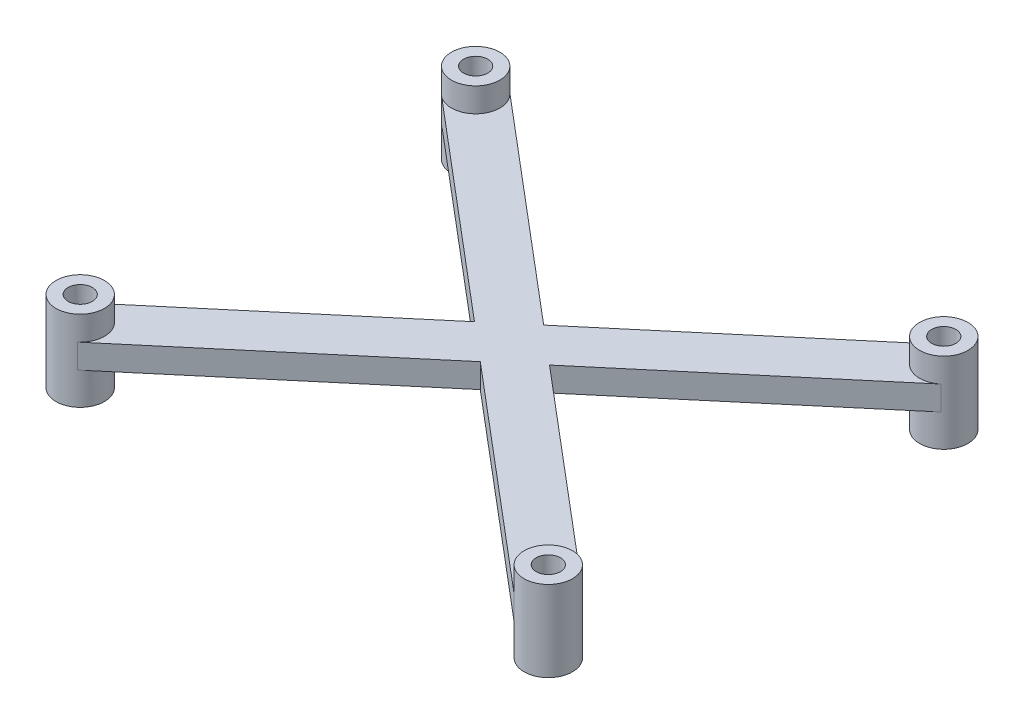
ISO-10303-21;
HEADER;
FILE_DESCRIPTION(('STEP AP214'),'2;1');
FILE_NAME('part.step','',(''),(''),'','','');
FILE_SCHEMA(('AUTOMOTIVE_DESIGN { 1 0 10303 214 1 1 1 1 }'));
ENDSEC;
DATA;
#1=APPLICATION_CONTEXT('core data for automotive mechanical design processes');
#2=APPLICATION_PROTOCOL_DEFINITION('international standard','automotive_design',2000,#1);
#3=PRODUCT_CONTEXT('',#1,'mechanical');
#4=PRODUCT('Part','Part','',(#3));
#5=PRODUCT_RELATED_PRODUCT_CATEGORY('part','',(#4));
#6=PRODUCT_DEFINITION_FORMATION('','',#4);
#7=PRODUCT_DEFINITION_CONTEXT('part definition',#1,'design');
#8=PRODUCT_DEFINITION('design','',#6,#7);
#9=PRODUCT_DEFINITION_SHAPE('','',#8);
#10=(LENGTH_UNIT() NAMED_UNIT(*) SI_UNIT(.MILLI.,.METRE.));
#11=(NAMED_UNIT(*) PLANE_ANGLE_UNIT() SI_UNIT($,.RADIAN.));
#12=(NAMED_UNIT(*) SI_UNIT($,.STERADIAN.) SOLID_ANGLE_UNIT());
#13=UNCERTAINTY_MEASURE_WITH_UNIT(LENGTH_MEASURE(1.E-05),#10,'distance_accuracy_value','');
#14=(GEOMETRIC_REPRESENTATION_CONTEXT(3) GLOBAL_UNCERTAINTY_ASSIGNED_CONTEXT((#13)) GLOBAL_UNIT_ASSIGNED_CONTEXT((#10,
#11,#12)) REPRESENTATION_CONTEXT('',''));
#15=CARTESIAN_POINT('',(0.,0.,0.));
#16=DIRECTION('',(0.,0.,1.));
#17=DIRECTION('',(1.,0.,0.));
#18=AXIS2_PLACEMENT_3D('',#15,#16,#17);
#19=CARTESIAN_POINT('',(-29.,-4.,-24.5));
#20=DIRECTION('',(0.,1.,0.));
#21=DIRECTION('',(0.,0.,1.));
#22=AXIS2_PLACEMENT_3D('',#19,#20,#21);
#23=CYLINDRICAL_SURFACE('',#22,3.);
#24=CARTESIAN_POINT('',(-29.,-4.,-24.5));
#25=DIRECTION('',(0.,1.,0.));
#26=DIRECTION('',(0.,0.,1.));
#27=AXIS2_PLACEMENT_3D('',#24,#25,#26);
#28=CIRCLE('',#27,3.);
#29=CARTESIAN_POINT('',(-29.,-4.,-21.5));
#30=VERTEX_POINT('',#29);
#31=EDGE_CURVE('E296',#30,#30,#28,.T.);
#32=ORIENTED_EDGE('',*,*,#31,.T.);
#33=EDGE_LOOP('',(#32));
#34=FACE_BOUND('',#33,.T.);
#35=CARTESIAN_POINT('',(-29.,0.,-24.5));
#36=DIRECTION('',(0.,1.,0.));
#37=DIRECTION('',(0.,0.,1.));
#38=AXIS2_PLACEMENT_3D('',#35,#36,#37);
#39=CIRCLE('',#38,3.);
#40=CARTESIAN_POINT('',(-30.9360549475046,0.,-22.2083431233619));
#41=VERTEX_POINT('',#40);
#42=CARTESIAN_POINT('',(-27.0639450524954,0.,-26.7916568766381));
#43=VERTEX_POINT('',#42);
#44=EDGE_CURVE('E206',#41,#43,#39,.T.);
#45=ORIENTED_EDGE('',*,*,#44,.F.);
#46=DIRECTION('',(0.,-1.,0.));
#47=VECTOR('',#46,1.);
#48=CARTESIAN_POINT('',(-30.9360549475046,3.,-22.2083431233619));
#49=LINE('',#48,#47);
#50=CARTESIAN_POINT('',(-30.9360549475046,3.,-22.2083431233619));
#51=VERTEX_POINT('',#50);
#52=EDGE_CURVE('E298',#51,#41,#49,.T.);
#53=ORIENTED_EDGE('',*,*,#52,.F.);
#54=CARTESIAN_POINT('',(-29.,3.,-24.5));
#55=DIRECTION('',(0.,1.,0.));
#56=DIRECTION('',(0.,0.,1.));
#57=AXIS2_PLACEMENT_3D('',#54,#55,#56);
#58=CIRCLE('',#57,3.);
#59=CARTESIAN_POINT('',(-27.0639450524954,3.,-26.7916568766381));
#60=VERTEX_POINT('',#59);
#61=EDGE_CURVE('E212',#51,#60,#58,.T.);
#62=ORIENTED_EDGE('',*,*,#61,.T.);
#63=DIRECTION('',(0.,-1.,0.));
#64=VECTOR('',#63,1.);
#65=CARTESIAN_POINT('',(-27.0639450524954,3.,-26.7916568766381));
#66=LINE('',#65,#64);
#67=EDGE_CURVE('E301',#60,#43,#66,.T.);
#68=ORIENTED_EDGE('',*,*,#67,.T.);
#69=EDGE_LOOP('',(#45,#53,#62,#68));
#70=FACE_BOUND('',#69,.T.);
#71=CARTESIAN_POINT('',(-29.,6.,-24.5));
#72=DIRECTION('',(0.,1.,0.));
#73=DIRECTION('',(0.,0.,1.));
#74=AXIS2_PLACEMENT_3D('',#71,#72,#73);
#75=CIRCLE('',#74,3.);
#76=CARTESIAN_POINT('',(-29.,6.,-21.5));
#77=VERTEX_POINT('',#76);
#78=EDGE_CURVE('E478',#77,#77,#75,.T.);
#79=ORIENTED_EDGE('',*,*,#78,.F.);
#80=EDGE_LOOP('',(#79));
#81=FACE_BOUND('',#80,.T.);
#82=ADVANCED_FACE('F203',(#34,#70,#81),#23,.T.);
#83=CARTESIAN_POINT('',(-29.,-4.,-24.5));
#84=DIRECTION('',(0.,1.,0.));
#85=DIRECTION('',(0.,0.,1.));
#86=AXIS2_PLACEMENT_3D('',#83,#84,#85);
#87=PLANE('',#86);
#88=CARTESIAN_POINT('',(-29.,-4.,-24.5));
#89=DIRECTION('',(0.,1.,0.));
#90=DIRECTION('',(0.,0.,1.));
#91=AXIS2_PLACEMENT_3D('',#88,#89,#90);
#92=CIRCLE('',#91,1.5);
#93=CARTESIAN_POINT('',(-29.,-4.,-23.));
#94=VERTEX_POINT('',#93);
#95=EDGE_CURVE('E477',#94,#94,#92,.T.);
#96=ORIENTED_EDGE('',*,*,#95,.T.);
#97=EDGE_LOOP('',(#96));
#98=FACE_BOUND('',#97,.T.);
#99=ORIENTED_EDGE('',*,*,#31,.F.);
#100=EDGE_LOOP('',(#99));
#101=FACE_BOUND('',#100,.T.);
#102=ADVANCED_FACE('F514',(#98,#101),#87,.F.);
#103=CARTESIAN_POINT('',(0.,0.,0.));
#104=DIRECTION('',(0.,1.,0.));
#105=DIRECTION('',(0.,0.,1.));
#106=AXIS2_PLACEMENT_3D('',#103,#104,#105);
#107=PLANE('',#106);
#108=DIRECTION('',(-0.763885625546045,0.,0.64535164916821));
#109=VECTOR('',#108,1.);
#110=CARTESIAN_POINT('',(-1.93605494750463,0.,-2.29165687663813));
#111=LINE('',#110,#109);
#112=CARTESIAN_POINT('',(27.0639450524954,0.,-26.7916568766381));
#113=VERTEX_POINT('',#112);
#114=CARTESIAN_POINT('',(0.,0.,-3.92728950470238));
#115=VERTEX_POINT('',#114);
#116=EDGE_CURVE('E332',#113,#115,#111,.T.);
#117=ORIENTED_EDGE('',*,*,#116,.F.);
#118=CARTESIAN_POINT('',(29.,0.,-24.5));
#119=DIRECTION('',(0.,1.,0.));
#120=DIRECTION('',(0.,0.,1.));
#121=AXIS2_PLACEMENT_3D('',#118,#119,#120);
#122=CIRCLE('',#121,3.);
#123=CARTESIAN_POINT('',(30.9360549475046,0.,-22.2083431233619));
#124=VERTEX_POINT('',#123);
#125=EDGE_CURVE('E398',#113,#124,#122,.T.);
#126=ORIENTED_EDGE('',*,*,#125,.T.);
#127=DIRECTION('',(-0.763885625546044,0.,0.64535164916821));
#128=VECTOR('',#127,1.);
#129=CARTESIAN_POINT('',(1.93605494750463,0.,2.29165687663813));
#130=LINE('',#129,#128);
#131=CARTESIAN_POINT('',(4.64862839332119,0.,0.));
#132=VERTEX_POINT('',#131);
#133=EDGE_CURVE('E328',#124,#132,#130,.T.);
#134=ORIENTED_EDGE('',*,*,#133,.T.);
#135=DIRECTION('',(0.763885625546045,0.,0.64535164916821));
#136=VECTOR('',#135,1.);
#137=CARTESIAN_POINT('',(1.93605494750463,0.,-2.29165687663813));
#138=LINE('',#137,#136);
#139=CARTESIAN_POINT('',(30.9360549475046,0.,22.2083431233619));
#140=VERTEX_POINT('',#139);
#141=EDGE_CURVE('E324',#132,#140,#138,.T.);
#142=ORIENTED_EDGE('',*,*,#141,.T.);
#143=CARTESIAN_POINT('',(29.,0.,24.5));
#144=DIRECTION('',(0.,1.,0.));
#145=DIRECTION('',(0.,0.,1.));
#146=AXIS2_PLACEMENT_3D('',#143,#144,#145);
#147=CIRCLE('',#146,3.);
#148=CARTESIAN_POINT('',(27.0639450524954,0.,26.7916568766381));
#149=VERTEX_POINT('',#148);
#150=EDGE_CURVE('E424',#140,#149,#147,.T.);
#151=ORIENTED_EDGE('',*,*,#150,.T.);
#152=DIRECTION('',(0.763885625546045,0.,0.64535164916821));
#153=VECTOR('',#152,1.);
#154=CARTESIAN_POINT('',(-1.93605494750463,0.,2.29165687663813));
#155=LINE('',#154,#153);
#156=CARTESIAN_POINT('',(0.,0.,3.92728950470239));
#157=VERTEX_POINT('',#156);
#158=EDGE_CURVE('E319',#157,#149,#155,.T.);
#159=ORIENTED_EDGE('',*,*,#158,.F.);
#160=DIRECTION('',(-0.763885625546044,0.,0.64535164916821));
#161=VECTOR('',#160,1.);
#162=CARTESIAN_POINT('',(1.93605494750463,0.,2.29165687663813));
#163=LINE('',#162,#161);
#164=CARTESIAN_POINT('',(-27.0639450524954,0.,26.7916568766381));
#165=VERTEX_POINT('',#164);
#166=EDGE_CURVE('E315',#157,#165,#163,.T.);
#167=ORIENTED_EDGE('',*,*,#166,.T.);
#168=CARTESIAN_POINT('',(-29.,0.,24.5));
#169=DIRECTION('',(0.,1.,0.));
#170=DIRECTION('',(0.,0.,1.));
#171=AXIS2_PLACEMENT_3D('',#168,#169,#170);
#172=CIRCLE('',#171,3.);
#173=CARTESIAN_POINT('',(-30.9360549475046,0.,22.2083431233619));
#174=VERTEX_POINT('',#173);
#175=EDGE_CURVE('E320',#165,#174,#172,.T.);
#176=ORIENTED_EDGE('',*,*,#175,.T.);
#177=DIRECTION('',(-0.763885625546045,0.,0.64535164916821));
#178=VECTOR('',#177,1.);
#179=CARTESIAN_POINT('',(-1.93605494750463,0.,-2.29165687663813));
#180=LINE('',#179,#178);
#181=CARTESIAN_POINT('',(-4.64862839332119,0.,0.));
#182=VERTEX_POINT('',#181);
#183=EDGE_CURVE('E342',#182,#174,#180,.T.);
#184=ORIENTED_EDGE('',*,*,#183,.F.);
#185=DIRECTION('',(0.763885625546045,0.,0.64535164916821));
#186=VECTOR('',#185,1.);
#187=CARTESIAN_POINT('',(-1.93605494750463,0.,2.29165687663813));
#188=LINE('',#187,#186);
#189=EDGE_CURVE('E261',#41,#182,#188,.T.);
#190=ORIENTED_EDGE('',*,*,#189,.F.);
#191=ORIENTED_EDGE('',*,*,#44,.T.);
#192=DIRECTION('',(0.763885625546045,0.,0.64535164916821));
#193=VECTOR('',#192,1.);
#194=CARTESIAN_POINT('',(1.93605494750463,0.,-2.29165687663813));
#195=LINE('',#194,#193);
#196=EDGE_CURVE('E336',#43,#115,#195,.T.);
#197=ORIENTED_EDGE('',*,*,#196,.T.);
#198=EDGE_LOOP('',(#117,#126,#134,#142,#151,#159,#167,#176,#184,#190,#191,#197));
#199=FACE_BOUND('',#198,.T.);
#200=ADVANCED_FACE('F386',(#199),#107,.F.);
#201=CARTESIAN_POINT('',(1.93605494750463,3.,2.29165687663813));
#202=DIRECTION('',(0.64535164916821,0.,0.763885625546044));
#203=DIRECTION('',(0.763885625546044,0.,-0.64535164916821));
#204=AXIS2_PLACEMENT_3D('',#201,#202,#203);
#205=PLANE('',#204);
#206=ORIENTED_EDGE('',*,*,#166,.F.);
#207=DIRECTION('',(0.,-1.,0.));
#208=VECTOR('',#207,1.);
#209=CARTESIAN_POINT('',(0.,3.,3.92728950470239));
#210=LINE('',#209,#208);
#211=CARTESIAN_POINT('',(0.,3.,3.92728950470239));
#212=VERTEX_POINT('',#211);
#213=EDGE_CURVE('E269',#212,#157,#210,.T.);
#214=ORIENTED_EDGE('',*,*,#213,.F.);
#215=DIRECTION('',(-0.763885625546044,0.,0.64535164916821));
#216=VECTOR('',#215,1.);
#217=CARTESIAN_POINT('',(1.93605494750463,3.,2.29165687663813));
#218=LINE('',#217,#216);
#219=CARTESIAN_POINT('',(-27.0639450524954,3.,26.7916568766381));
#220=VERTEX_POINT('',#219);
#221=EDGE_CURVE('E345',#212,#220,#218,.T.);
#222=ORIENTED_EDGE('',*,*,#221,.T.);
#223=DIRECTION('',(0.,-1.,0.));
#224=VECTOR('',#223,1.);
#225=CARTESIAN_POINT('',(-27.0639450524954,3.,26.7916568766381));
#226=LINE('',#225,#224);
#227=EDGE_CURVE('E376',#220,#165,#226,.T.);
#228=ORIENTED_EDGE('',*,*,#227,.T.);
#229=EDGE_LOOP('',(#206,#214,#222,#228));
#230=FACE_BOUND('',#229,.T.);
#231=ADVANCED_FACE('F523',(#230),#205,.T.);
#232=CARTESIAN_POINT('',(-1.93605494750463,3.,2.29165687663813));
#233=DIRECTION('',(0.64535164916821,0.,-0.763885625546044));
#234=DIRECTION('',(-0.763885625546044,0.,-0.64535164916821));
#235=AXIS2_PLACEMENT_3D('',#232,#233,#234);
#236=PLANE('',#235);
#237=ORIENTED_EDGE('',*,*,#158,.T.);
#238=DIRECTION('',(0.,-1.,0.));
#239=VECTOR('',#238,1.);
#240=CARTESIAN_POINT('',(27.0639450524954,3.,26.7916568766381));
#241=LINE('',#240,#239);
#242=CARTESIAN_POINT('',(27.0639450524954,3.,26.7916568766381));
#243=VERTEX_POINT('',#242);
#244=EDGE_CURVE('E370',#243,#149,#241,.T.);
#245=ORIENTED_EDGE('',*,*,#244,.F.);
#246=DIRECTION('',(0.763885625546045,0.,0.64535164916821));
#247=VECTOR('',#246,1.);
#248=CARTESIAN_POINT('',(-1.93605494750463,3.,2.29165687663813));
#249=LINE('',#248,#247);
#250=EDGE_CURVE('E437',#212,#243,#249,.T.);
#251=ORIENTED_EDGE('',*,*,#250,.F.);
#252=ORIENTED_EDGE('',*,*,#213,.T.);
#253=EDGE_LOOP('',(#237,#245,#251,#252));
#254=FACE_BOUND('',#253,.T.);
#255=ADVANCED_FACE('F436',(#254),#236,.F.);
#256=CARTESIAN_POINT('',(1.93605494750463,3.,-2.29165687663813));
#257=DIRECTION('',(0.64535164916821,0.,-0.763885625546044));
#258=DIRECTION('',(-0.763885625546044,0.,-0.64535164916821));
#259=AXIS2_PLACEMENT_3D('',#256,#257,#258);
#260=PLANE('',#259);
#261=ORIENTED_EDGE('',*,*,#141,.F.);
#262=DIRECTION('',(0.,-1.,0.));
#263=VECTOR('',#262,1.);
#264=CARTESIAN_POINT('',(4.64862839332119,3.,0.));
#265=LINE('',#264,#263);
#266=CARTESIAN_POINT('',(4.64862839332119,3.,0.));
#267=VERTEX_POINT('',#266);
#268=EDGE_CURVE('E363',#267,#132,#265,.T.);
#269=ORIENTED_EDGE('',*,*,#268,.F.);
#270=DIRECTION('',(0.763885625546045,0.,0.64535164916821));
#271=VECTOR('',#270,1.);
#272=CARTESIAN_POINT('',(1.93605494750463,3.,-2.29165687663813));
#273=LINE('',#272,#271);
#274=CARTESIAN_POINT('',(30.9360549475046,3.,22.2083431233619));
#275=VERTEX_POINT('',#274);
#276=EDGE_CURVE('E440',#267,#275,#273,.T.);
#277=ORIENTED_EDGE('',*,*,#276,.T.);
#278=DIRECTION('',(0.,-1.,0.));
#279=VECTOR('',#278,1.);
#280=CARTESIAN_POINT('',(30.9360549475046,3.,22.2083431233619));
#281=LINE('',#280,#279);
#282=EDGE_CURVE('E366',#275,#140,#281,.T.);
#283=ORIENTED_EDGE('',*,*,#282,.T.);
#284=EDGE_LOOP('',(#261,#269,#277,#283));
#285=FACE_BOUND('',#284,.T.);
#286=ADVANCED_FACE('F420',(#285),#260,.T.);
#287=CARTESIAN_POINT('',(1.93605494750463,3.,2.29165687663813));
#288=DIRECTION('',(0.64535164916821,0.,0.763885625546044));
#289=DIRECTION('',(0.763885625546044,0.,-0.64535164916821));
#290=AXIS2_PLACEMENT_3D('',#287,#288,#289);
#291=PLANE('',#290);
#292=ORIENTED_EDGE('',*,*,#133,.F.);
#293=DIRECTION('',(0.,-1.,0.));
#294=VECTOR('',#293,1.);
#295=CARTESIAN_POINT('',(30.9360549475046,3.,-22.2083431233619));
#296=LINE('',#295,#294);
#297=CARTESIAN_POINT('',(30.9360549475046,3.,-22.2083431233619));
#298=VERTEX_POINT('',#297);
#299=EDGE_CURVE('E359',#298,#124,#296,.T.);
#300=ORIENTED_EDGE('',*,*,#299,.F.);
#301=DIRECTION('',(-0.763885625546044,0.,0.64535164916821));
#302=VECTOR('',#301,1.);
#303=CARTESIAN_POINT('',(1.93605494750463,3.,2.29165687663813));
#304=LINE('',#303,#302);
#305=EDGE_CURVE('E416',#298,#267,#304,.T.);
#306=ORIENTED_EDGE('',*,*,#305,.T.);
#307=ORIENTED_EDGE('',*,*,#268,.T.);
#308=EDGE_LOOP('',(#292,#300,#306,#307));
#309=FACE_BOUND('',#308,.T.);
#310=ADVANCED_FACE('F413',(#309),#291,.T.);
#311=CARTESIAN_POINT('',(-1.93605494750463,3.,-2.29165687663813));
#312=DIRECTION('',(0.64535164916821,0.,0.763885625546044));
#313=DIRECTION('',(0.763885625546045,0.,-0.64535164916821));
#314=AXIS2_PLACEMENT_3D('',#311,#312,#313);
#315=PLANE('',#314);
#316=ORIENTED_EDGE('',*,*,#116,.T.);
#317=DIRECTION('',(0.,-1.,0.));
#318=VECTOR('',#317,1.);
#319=CARTESIAN_POINT('',(0.,3.,-3.92728950470238));
#320=LINE('',#319,#318);
#321=CARTESIAN_POINT('',(0.,3.,-3.92728950470238));
#322=VERTEX_POINT('',#321);
#323=EDGE_CURVE('E352',#322,#115,#320,.T.);
#324=ORIENTED_EDGE('',*,*,#323,.F.);
#325=DIRECTION('',(-0.763885625546045,0.,0.64535164916821));
#326=VECTOR('',#325,1.);
#327=CARTESIAN_POINT('',(-1.93605494750463,3.,-2.29165687663813));
#328=LINE('',#327,#326);
#329=CARTESIAN_POINT('',(27.0639450524954,3.,-26.7916568766381));
#330=VERTEX_POINT('',#329);
#331=EDGE_CURVE('E311',#330,#322,#328,.T.);
#332=ORIENTED_EDGE('',*,*,#331,.F.);
#333=DIRECTION('',(0.,-1.,0.));
#334=VECTOR('',#333,1.);
#335=CARTESIAN_POINT('',(27.0639450524954,3.,-26.7916568766381));
#336=LINE('',#335,#334);
#337=EDGE_CURVE('E355',#330,#113,#336,.T.);
#338=ORIENTED_EDGE('',*,*,#337,.T.);
#339=EDGE_LOOP('',(#316,#324,#332,#338));
#340=FACE_BOUND('',#339,.T.);
#341=ADVANCED_FACE('F394',(#340),#315,.F.);
#342=CARTESIAN_POINT('',(1.93605494750463,3.,-2.29165687663813));
#343=DIRECTION('',(0.64535164916821,0.,-0.763885625546044));
#344=DIRECTION('',(-0.763885625546044,0.,-0.64535164916821));
#345=AXIS2_PLACEMENT_3D('',#342,#343,#344);
#346=PLANE('',#345);
#347=ORIENTED_EDGE('',*,*,#196,.F.);
#348=ORIENTED_EDGE('',*,*,#67,.F.);
#349=DIRECTION('',(0.763885625546045,0.,0.64535164916821));
#350=VECTOR('',#349,1.);
#351=CARTESIAN_POINT('',(1.93605494750463,3.,-2.29165687663813));
#352=LINE('',#351,#350);
#353=EDGE_CURVE('E293',#60,#322,#352,.T.);
#354=ORIENTED_EDGE('',*,*,#353,.T.);
#355=ORIENTED_EDGE('',*,*,#323,.T.);
#356=EDGE_LOOP('',(#347,#348,#354,#355));
#357=FACE_BOUND('',#356,.T.);
#358=ADVANCED_FACE('F390',(#357),#346,.T.);
#359=CARTESIAN_POINT('',(-1.93605494750463,3.,2.29165687663813));
#360=DIRECTION('',(0.64535164916821,0.,-0.763885625546044));
#361=DIRECTION('',(-0.763885625546044,0.,-0.64535164916821));
#362=AXIS2_PLACEMENT_3D('',#359,#360,#361);
#363=PLANE('',#362);
#364=ORIENTED_EDGE('',*,*,#189,.T.);
#365=DIRECTION('',(0.,-1.,0.));
#366=VECTOR('',#365,1.);
#367=CARTESIAN_POINT('',(-4.64862839332119,3.,0.));
#368=LINE('',#367,#366);
#369=CARTESIAN_POINT('',(-4.64862839332119,3.,0.));
#370=VERTEX_POINT('',#369);
#371=EDGE_CURVE('E302',#370,#182,#368,.T.);
#372=ORIENTED_EDGE('',*,*,#371,.F.);
#373=DIRECTION('',(0.763885625546045,0.,0.64535164916821));
#374=VECTOR('',#373,1.);
#375=CARTESIAN_POINT('',(-1.93605494750463,3.,2.29165687663813));
#376=LINE('',#375,#374);
#377=EDGE_CURVE('E290',#51,#370,#376,.T.);
#378=ORIENTED_EDGE('',*,*,#377,.F.);
#379=ORIENTED_EDGE('',*,*,#52,.T.);
#380=EDGE_LOOP('',(#364,#372,#378,#379));
#381=FACE_BOUND('',#380,.T.);
#382=ADVANCED_FACE('F304',(#381),#363,.F.);
#383=CARTESIAN_POINT('',(-1.93605494750463,3.,-2.29165687663813));
#384=DIRECTION('',(0.64535164916821,0.,0.763885625546044));
#385=DIRECTION('',(0.763885625546045,0.,-0.64535164916821));
#386=AXIS2_PLACEMENT_3D('',#383,#384,#385);
#387=PLANE('',#386);
#388=ORIENTED_EDGE('',*,*,#183,.T.);
#389=DIRECTION('',(0.,-1.,0.));
#390=VECTOR('',#389,1.);
#391=CARTESIAN_POINT('',(-30.9360549475046,3.,22.2083431233619));
#392=LINE('',#391,#390);
#393=CARTESIAN_POINT('',(-30.9360549475046,3.,22.2083431233619));
#394=VERTEX_POINT('',#393);
#395=EDGE_CURVE('E228',#394,#174,#392,.T.);
#396=ORIENTED_EDGE('',*,*,#395,.F.);
#397=DIRECTION('',(-0.763885625546045,0.,0.64535164916821));
#398=VECTOR('',#397,1.);
#399=CARTESIAN_POINT('',(-1.93605494750463,3.,-2.29165687663813));
#400=LINE('',#399,#398);
#401=EDGE_CURVE('E306',#370,#394,#400,.T.);
#402=ORIENTED_EDGE('',*,*,#401,.F.);
#403=ORIENTED_EDGE('',*,*,#371,.T.);
#404=EDGE_LOOP('',(#388,#396,#402,#403));
#405=FACE_BOUND('',#404,.T.);
#406=ADVANCED_FACE('F544',(#405),#387,.F.);
#407=CARTESIAN_POINT('',(0.,3.,0.));
#408=DIRECTION('',(0.,1.,0.));
#409=DIRECTION('',(0.,0.,1.));
#410=AXIS2_PLACEMENT_3D('',#407,#408,#409);
#411=PLANE('',#410);
#412=CARTESIAN_POINT('',(29.,3.,-24.5));
#413=DIRECTION('',(0.,1.,0.));
#414=DIRECTION('',(0.,0.,1.));
#415=AXIS2_PLACEMENT_3D('',#412,#413,#414);
#416=CIRCLE('',#415,3.);
#417=EDGE_CURVE('E12',#330,#298,#416,.T.);
#418=ORIENTED_EDGE('',*,*,#417,.F.);
#419=ORIENTED_EDGE('',*,*,#331,.T.);
#420=ORIENTED_EDGE('',*,*,#353,.F.);
#421=ORIENTED_EDGE('',*,*,#61,.F.);
#422=ORIENTED_EDGE('',*,*,#377,.T.);
#423=ORIENTED_EDGE('',*,*,#401,.T.);
#424=CARTESIAN_POINT('',(-29.,3.,24.5));
#425=DIRECTION('',(0.,1.,0.));
#426=DIRECTION('',(0.,0.,1.));
#427=AXIS2_PLACEMENT_3D('',#424,#425,#426);
#428=CIRCLE('',#427,3.);
#429=EDGE_CURVE('E445',#220,#394,#428,.T.);
#430=ORIENTED_EDGE('',*,*,#429,.F.);
#431=ORIENTED_EDGE('',*,*,#221,.F.);
#432=ORIENTED_EDGE('',*,*,#250,.T.);
#433=CARTESIAN_POINT('',(29.,3.,24.5));
#434=DIRECTION('',(0.,1.,0.));
#435=DIRECTION('',(0.,0.,1.));
#436=AXIS2_PLACEMENT_3D('',#433,#434,#435);
#437=CIRCLE('',#436,3.);
#438=EDGE_CURVE('E433',#275,#243,#437,.T.);
#439=ORIENTED_EDGE('',*,*,#438,.F.);
#440=ORIENTED_EDGE('',*,*,#276,.F.);
#441=ORIENTED_EDGE('',*,*,#305,.F.);
#442=EDGE_LOOP('',(#418,#419,#420,#421,#422,#423,#430,#431,#432,#439,#440,#441));
#443=FACE_BOUND('',#442,.T.);
#444=ADVANCED_FACE('F288',(#443),#411,.T.);
#445=CARTESIAN_POINT('',(29.,3.,-24.5));
#446=DIRECTION('',(0.,-1.,0.));
#447=DIRECTION('',(0.,0.,-1.));
#448=AXIS2_PLACEMENT_3D('',#445,#446,#447);
#449=CYLINDRICAL_SURFACE('',#448,2.99999999999999);
#450=ORIENTED_EDGE('',*,*,#337,.F.);
#451=ORIENTED_EDGE('',*,*,#417,.T.);
#452=ORIENTED_EDGE('',*,*,#299,.T.);
#453=ORIENTED_EDGE('',*,*,#125,.F.);
#454=EDGE_LOOP('',(#450,#451,#452,#453));
#455=FACE_BOUND('',#454,.T.);
#456=CARTESIAN_POINT('',(29.,-4.,-24.5));
#457=DIRECTION('',(0.,1.,0.));
#458=DIRECTION('',(0.,0.,1.));
#459=AXIS2_PLACEMENT_3D('',#456,#457,#458);
#460=CIRCLE('',#459,3.);
#461=CARTESIAN_POINT('',(29.,-4.,-21.5));
#462=VERTEX_POINT('',#461);
#463=EDGE_CURVE('E406',#462,#462,#460,.T.);
#464=ORIENTED_EDGE('',*,*,#463,.T.);
#465=EDGE_LOOP('',(#464));
#466=FACE_BOUND('',#465,.T.);
#467=CARTESIAN_POINT('',(29.,6.,-24.5));
#468=DIRECTION('',(0.,1.,0.));
#469=DIRECTION('',(0.,0.,1.));
#470=AXIS2_PLACEMENT_3D('',#467,#468,#469);
#471=CIRCLE('',#470,3.);
#472=CARTESIAN_POINT('',(29.,6.,-21.5));
#473=VERTEX_POINT('',#472);
#474=EDGE_CURVE('E470',#473,#473,#471,.T.);
#475=ORIENTED_EDGE('',*,*,#474,.F.);
#476=EDGE_LOOP('',(#475));
#477=FACE_BOUND('',#476,.T.);
#478=ADVANCED_FACE('F409',(#455,#466,#477),#449,.T.);
#479=CARTESIAN_POINT('',(29.,3.,24.5));
#480=DIRECTION('',(0.,-1.,0.));
#481=DIRECTION('',(0.,0.,-1.));
#482=AXIS2_PLACEMENT_3D('',#479,#480,#481);
#483=CYLINDRICAL_SURFACE('',#482,3.);
#484=ORIENTED_EDGE('',*,*,#282,.F.);
#485=ORIENTED_EDGE('',*,*,#438,.T.);
#486=ORIENTED_EDGE('',*,*,#244,.T.);
#487=ORIENTED_EDGE('',*,*,#150,.F.);
#488=EDGE_LOOP('',(#484,#485,#486,#487));
#489=FACE_BOUND('',#488,.T.);
#490=CARTESIAN_POINT('',(29.,-4.,24.5));
#491=DIRECTION('',(0.,1.,0.));
#492=DIRECTION('',(0.,0.,1.));
#493=AXIS2_PLACEMENT_3D('',#490,#491,#492);
#494=CIRCLE('',#493,3.);
#495=CARTESIAN_POINT('',(29.,-4.,27.5));
#496=VERTEX_POINT('',#495);
#497=EDGE_CURVE('E405',#496,#496,#494,.T.);
#498=ORIENTED_EDGE('',*,*,#497,.T.);
#499=EDGE_LOOP('',(#498));
#500=FACE_BOUND('',#499,.T.);
#501=CARTESIAN_POINT('',(29.,6.,24.5));
#502=DIRECTION('',(0.,1.,0.));
#503=DIRECTION('',(0.,0.,1.));
#504=AXIS2_PLACEMENT_3D('',#501,#502,#503);
#505=CIRCLE('',#504,3.);
#506=CARTESIAN_POINT('',(29.,6.,27.5));
#507=VERTEX_POINT('',#506);
#508=EDGE_CURVE('E463',#507,#507,#505,.T.);
#509=ORIENTED_EDGE('',*,*,#508,.F.);
#510=EDGE_LOOP('',(#509));
#511=FACE_BOUND('',#510,.T.);
#512=ADVANCED_FACE('F430',(#489,#500,#511),#483,.T.);
#513=CARTESIAN_POINT('',(-29.,3.,24.5));
#514=DIRECTION('',(0.,-1.,0.));
#515=DIRECTION('',(0.,0.,-1.));
#516=AXIS2_PLACEMENT_3D('',#513,#514,#515);
#517=CYLINDRICAL_SURFACE('',#516,2.99999999999999);
#518=ORIENTED_EDGE('',*,*,#395,.T.);
#519=ORIENTED_EDGE('',*,*,#175,.F.);
#520=ORIENTED_EDGE('',*,*,#227,.F.);
#521=ORIENTED_EDGE('',*,*,#429,.T.);
#522=EDGE_LOOP('',(#518,#519,#520,#521));
#523=FACE_BOUND('',#522,.T.);
#524=CARTESIAN_POINT('',(-29.,-4.,24.5));
#525=DIRECTION('',(0.,1.,0.));
#526=DIRECTION('',(0.,0.,1.));
#527=AXIS2_PLACEMENT_3D('',#524,#525,#526);
#528=CIRCLE('',#527,3.);
#529=CARTESIAN_POINT('',(-29.,-4.,27.5));
#530=VERTEX_POINT('',#529);
#531=EDGE_CURVE('E427',#530,#530,#528,.T.);
#532=ORIENTED_EDGE('',*,*,#531,.T.);
#533=EDGE_LOOP('',(#532));
#534=FACE_BOUND('',#533,.T.);
#535=CARTESIAN_POINT('',(-29.,6.,24.5));
#536=DIRECTION('',(0.,1.,0.));
#537=DIRECTION('',(0.,0.,1.));
#538=AXIS2_PLACEMENT_3D('',#535,#536,#537);
#539=CIRCLE('',#538,3.);
#540=CARTESIAN_POINT('',(-29.,6.,27.5));
#541=VERTEX_POINT('',#540);
#542=EDGE_CURVE('E462',#541,#541,#539,.T.);
#543=ORIENTED_EDGE('',*,*,#542,.F.);
#544=EDGE_LOOP('',(#543));
#545=FACE_BOUND('',#544,.T.);
#546=ADVANCED_FACE('F493',(#523,#534,#545),#517,.T.);
#547=CARTESIAN_POINT('',(-29.,-4.,24.5));
#548=DIRECTION('',(0.,1.,0.));
#549=DIRECTION('',(0.,0.,1.));
#550=AXIS2_PLACEMENT_3D('',#547,#548,#549);
#551=PLANE('',#550);
#552=CARTESIAN_POINT('',(-29.,-4.,24.5));
#553=DIRECTION('',(0.,1.,0.));
#554=DIRECTION('',(0.,0.,1.));
#555=AXIS2_PLACEMENT_3D('',#552,#553,#554);
#556=CIRCLE('',#555,1.5);
#557=CARTESIAN_POINT('',(-29.,-4.,26.));
#558=VERTEX_POINT('',#557);
#559=EDGE_CURVE('E676',#558,#558,#556,.T.);
#560=ORIENTED_EDGE('',*,*,#559,.T.);
#561=EDGE_LOOP('',(#560));
#562=FACE_BOUND('',#561,.T.);
#563=ORIENTED_EDGE('',*,*,#531,.F.);
#564=EDGE_LOOP('',(#563));
#565=FACE_BOUND('',#564,.T.);
#566=ADVANCED_FACE('F496',(#562,#565),#551,.F.);
#567=CARTESIAN_POINT('',(29.,-4.,24.5));
#568=DIRECTION('',(0.,1.,0.));
#569=DIRECTION('',(0.,0.,1.));
#570=AXIS2_PLACEMENT_3D('',#567,#568,#569);
#571=PLANE('',#570);
#572=CARTESIAN_POINT('',(29.,-4.,24.5));
#573=DIRECTION('',(0.,1.,0.));
#574=DIRECTION('',(0.,0.,1.));
#575=AXIS2_PLACEMENT_3D('',#572,#573,#574);
#576=CIRCLE('',#575,1.5);
#577=CARTESIAN_POINT('',(29.,-4.,26.));
#578=VERTEX_POINT('',#577);
#579=EDGE_CURVE('E670',#578,#578,#576,.T.);
#580=ORIENTED_EDGE('',*,*,#579,.T.);
#581=EDGE_LOOP('',(#580));
#582=FACE_BOUND('',#581,.T.);
#583=ORIENTED_EDGE('',*,*,#497,.F.);
#584=EDGE_LOOP('',(#583));
#585=FACE_BOUND('',#584,.T.);
#586=ADVANCED_FACE('F498',(#582,#585),#571,.F.);
#587=CARTESIAN_POINT('',(29.,-4.,-24.5));
#588=DIRECTION('',(0.,1.,0.));
#589=DIRECTION('',(0.,0.,1.));
#590=AXIS2_PLACEMENT_3D('',#587,#588,#589);
#591=PLANE('',#590);
#592=CARTESIAN_POINT('',(29.,-4.,-24.5));
#593=DIRECTION('',(0.,1.,0.));
#594=DIRECTION('',(0.,0.,1.));
#595=AXIS2_PLACEMENT_3D('',#592,#593,#594);
#596=CIRCLE('',#595,1.5);
#597=CARTESIAN_POINT('',(29.,-4.,-23.));
#598=VERTEX_POINT('',#597);
#599=EDGE_CURVE('E663',#598,#598,#596,.T.);
#600=ORIENTED_EDGE('',*,*,#599,.T.);
#601=EDGE_LOOP('',(#600));
#602=FACE_BOUND('',#601,.T.);
#603=ORIENTED_EDGE('',*,*,#463,.F.);
#604=EDGE_LOOP('',(#603));
#605=FACE_BOUND('',#604,.T.);
#606=ADVANCED_FACE('F505',(#602,#605),#591,.F.);
#607=CARTESIAN_POINT('',(-29.,6.,-24.5));
#608=DIRECTION('',(0.,1.,0.));
#609=DIRECTION('',(0.,0.,1.));
#610=AXIS2_PLACEMENT_3D('',#607,#608,#609);
#611=PLANE('',#610);
#612=CARTESIAN_POINT('',(-29.,6.,-24.5));
#613=DIRECTION('',(0.,1.,0.));
#614=DIRECTION('',(0.,0.,1.));
#615=AXIS2_PLACEMENT_3D('',#612,#613,#614);
#616=CIRCLE('',#615,1.5);
#617=CARTESIAN_POINT('',(-29.,6.,-23.));
#618=VERTEX_POINT('',#617);
#619=EDGE_CURVE('E671',#618,#618,#616,.T.);
#620=ORIENTED_EDGE('',*,*,#619,.F.);
#621=EDGE_LOOP('',(#620));
#622=FACE_BOUND('',#621,.T.);
#623=ORIENTED_EDGE('',*,*,#78,.T.);
#624=EDGE_LOOP('',(#623));
#625=FACE_BOUND('',#624,.T.);
#626=ADVANCED_FACE('F573',(#622,#625),#611,.T.);
#627=CARTESIAN_POINT('',(-29.,6.,24.5));
#628=DIRECTION('',(0.,1.,0.));
#629=DIRECTION('',(0.,0.,1.));
#630=AXIS2_PLACEMENT_3D('',#627,#628,#629);
#631=PLANE('',#630);
#632=CARTESIAN_POINT('',(-29.,6.,24.5));
#633=DIRECTION('',(0.,1.,0.));
#634=DIRECTION('',(0.,0.,1.));
#635=AXIS2_PLACEMENT_3D('',#632,#633,#634);
#636=CIRCLE('',#635,1.5);
#637=CARTESIAN_POINT('',(-29.,6.,26.));
#638=VERTEX_POINT('',#637);
#639=EDGE_CURVE('E689',#638,#638,#636,.T.);
#640=ORIENTED_EDGE('',*,*,#639,.F.);
#641=EDGE_LOOP('',(#640));
#642=FACE_BOUND('',#641,.T.);
#643=ORIENTED_EDGE('',*,*,#542,.T.);
#644=EDGE_LOOP('',(#643));
#645=FACE_BOUND('',#644,.T.);
#646=ADVANCED_FACE('F579',(#642,#645),#631,.T.);
#647=CARTESIAN_POINT('',(29.,6.,24.5));
#648=DIRECTION('',(0.,1.,0.));
#649=DIRECTION('',(0.,0.,1.));
#650=AXIS2_PLACEMENT_3D('',#647,#648,#649);
#651=PLANE('',#650);
#652=CARTESIAN_POINT('',(29.,6.,24.5));
#653=DIRECTION('',(0.,1.,0.));
#654=DIRECTION('',(0.,0.,1.));
#655=AXIS2_PLACEMENT_3D('',#652,#653,#654);
#656=CIRCLE('',#655,1.5);
#657=CARTESIAN_POINT('',(29.,6.,26.));
#658=VERTEX_POINT('',#657);
#659=EDGE_CURVE('E693',#658,#658,#656,.T.);
#660=ORIENTED_EDGE('',*,*,#659,.F.);
#661=EDGE_LOOP('',(#660));
#662=FACE_BOUND('',#661,.T.);
#663=ORIENTED_EDGE('',*,*,#508,.T.);
#664=EDGE_LOOP('',(#663));
#665=FACE_BOUND('',#664,.T.);
#666=ADVANCED_FACE('F591',(#662,#665),#651,.T.);
#667=CARTESIAN_POINT('',(29.,6.,-24.5));
#668=DIRECTION('',(0.,1.,0.));
#669=DIRECTION('',(0.,0.,1.));
#670=AXIS2_PLACEMENT_3D('',#667,#668,#669);
#671=PLANE('',#670);
#672=CARTESIAN_POINT('',(29.,6.,-24.5));
#673=DIRECTION('',(0.,1.,0.));
#674=DIRECTION('',(0.,0.,1.));
#675=AXIS2_PLACEMENT_3D('',#672,#673,#674);
#676=CIRCLE('',#675,1.5);
#677=CARTESIAN_POINT('',(29.,6.,-23.));
#678=VERTEX_POINT('',#677);
#679=EDGE_CURVE('E678',#678,#678,#676,.T.);
#680=ORIENTED_EDGE('',*,*,#679,.F.);
#681=EDGE_LOOP('',(#680));
#682=FACE_BOUND('',#681,.T.);
#683=ORIENTED_EDGE('',*,*,#474,.T.);
#684=EDGE_LOOP('',(#683));
#685=FACE_BOUND('',#684,.T.);
#686=ADVANCED_FACE('F601',(#682,#685),#671,.T.);
#687=CARTESIAN_POINT('',(29.,-7.,-24.5));
#688=DIRECTION('',(0.,1.,0.));
#689=DIRECTION('',(0.,0.,1.));
#690=AXIS2_PLACEMENT_3D('',#687,#688,#689);
#691=CYLINDRICAL_SURFACE('',#690,1.5);
#692=ORIENTED_EDGE('',*,*,#679,.T.);
#693=EDGE_LOOP('',(#692));
#694=FACE_BOUND('',#693,.T.);
#695=ORIENTED_EDGE('',*,*,#599,.F.);
#696=EDGE_LOOP('',(#695));
#697=FACE_BOUND('',#696,.T.);
#698=ADVANCED_FACE('F611',(#694,#697),#691,.F.);
#699=CARTESIAN_POINT('',(29.,-7.,24.5));
#700=DIRECTION('',(0.,1.,0.));
#701=DIRECTION('',(0.,0.,1.));
#702=AXIS2_PLACEMENT_3D('',#699,#700,#701);
#703=CYLINDRICAL_SURFACE('',#702,1.5);
#704=ORIENTED_EDGE('',*,*,#659,.T.);
#705=EDGE_LOOP('',(#704));
#706=FACE_BOUND('',#705,.T.);
#707=ORIENTED_EDGE('',*,*,#579,.F.);
#708=EDGE_LOOP('',(#707));
#709=FACE_BOUND('',#708,.T.);
#710=ADVANCED_FACE('F621',(#706,#709),#703,.F.);
#711=CARTESIAN_POINT('',(-29.,-7.,24.5));
#712=DIRECTION('',(0.,1.,0.));
#713=DIRECTION('',(0.,0.,1.));
#714=AXIS2_PLACEMENT_3D('',#711,#712,#713);
#715=CYLINDRICAL_SURFACE('',#714,1.5);
#716=ORIENTED_EDGE('',*,*,#639,.T.);
#717=EDGE_LOOP('',(#716));
#718=FACE_BOUND('',#717,.T.);
#719=ORIENTED_EDGE('',*,*,#559,.F.);
#720=EDGE_LOOP('',(#719));
#721=FACE_BOUND('',#720,.T.);
#722=ADVANCED_FACE('F631',(#718,#721),#715,.F.);
#723=CARTESIAN_POINT('',(-29.,-7.,-24.5));
#724=DIRECTION('',(0.,1.,0.));
#725=DIRECTION('',(0.,0.,1.));
#726=AXIS2_PLACEMENT_3D('',#723,#724,#725);
#727=CYLINDRICAL_SURFACE('',#726,1.5);
#728=ORIENTED_EDGE('',*,*,#619,.T.);
#729=EDGE_LOOP('',(#728));
#730=FACE_BOUND('',#729,.T.);
#731=ORIENTED_EDGE('',*,*,#95,.F.);
#732=EDGE_LOOP('',(#731));
#733=FACE_BOUND('',#732,.T.);
#734=ADVANCED_FACE('F641',(#730,#733),#727,.F.);
#735=CLOSED_SHELL('',(#82,#102,#200,#231,#255,#286,#310,#341,#358,#382,#406,#444,#478,#512,#546,
#566,#586,#606,#626,#646,#666,#686,#698,#710,#722,#734));
#736=MANIFOLD_SOLID_BREP('B2',#735);
#737=ADVANCED_BREP_SHAPE_REPRESENTATION('',(#18,#736),#14);
#738=SHAPE_DEFINITION_REPRESENTATION(#9,#737);
ENDSEC;
END-ISO-10303-21;
